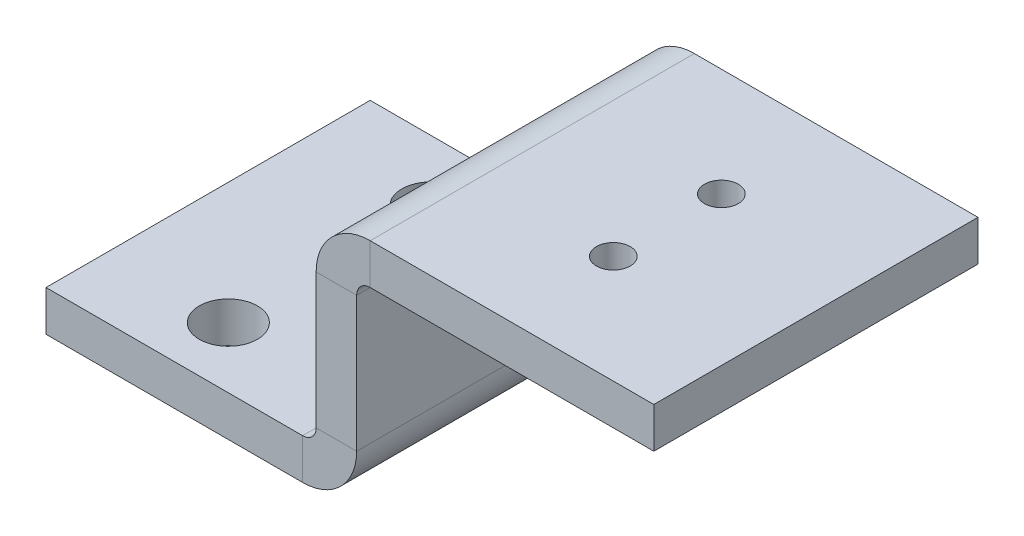
ISO-10303-21;
HEADER;
FILE_DESCRIPTION(('STEP AP214'),'2;1');
FILE_NAME('part.step','',(''),(''),'','','');
FILE_SCHEMA(('AUTOMOTIVE_DESIGN { 1 0 10303 214 1 1 1 1 }'));
ENDSEC;
DATA;
#1=APPLICATION_CONTEXT('core data for automotive mechanical design processes');
#2=APPLICATION_PROTOCOL_DEFINITION('international standard','automotive_design',2000,#1);
#3=PRODUCT_CONTEXT('',#1,'mechanical');
#4=PRODUCT('Part','Part','',(#3));
#5=PRODUCT_RELATED_PRODUCT_CATEGORY('part','',(#4));
#6=PRODUCT_DEFINITION_FORMATION('','',#4);
#7=PRODUCT_DEFINITION_CONTEXT('part definition',#1,'design');
#8=PRODUCT_DEFINITION('design','',#6,#7);
#9=PRODUCT_DEFINITION_SHAPE('','',#8);
#10=(LENGTH_UNIT() NAMED_UNIT(*) SI_UNIT(.MILLI.,.METRE.));
#11=(NAMED_UNIT(*) PLANE_ANGLE_UNIT() SI_UNIT($,.RADIAN.));
#12=(NAMED_UNIT(*) SI_UNIT($,.STERADIAN.) SOLID_ANGLE_UNIT());
#13=UNCERTAINTY_MEASURE_WITH_UNIT(LENGTH_MEASURE(1.E-05),#10,'distance_accuracy_value','');
#14=(GEOMETRIC_REPRESENTATION_CONTEXT(3) GLOBAL_UNCERTAINTY_ASSIGNED_CONTEXT((#13)) GLOBAL_UNIT_ASSIGNED_CONTEXT((#10,
#11,#12)) REPRESENTATION_CONTEXT('',''));
#15=CARTESIAN_POINT('',(0.,0.,0.));
#16=DIRECTION('',(0.,0.,1.));
#17=DIRECTION('',(1.,0.,0.));
#18=AXIS2_PLACEMENT_3D('',#15,#16,#17);
#19=CARTESIAN_POINT('',(0.,1.,24.));
#20=DIRECTION('',(0.,0.,1.));
#21=DIRECTION('',(1.,0.,0.));
#22=AXIS2_PLACEMENT_3D('',#19,#20,#21);
#23=PLANE('',#22);
#24=DIRECTION('',(1.,0.,0.));
#25=VECTOR('',#24,1.);
#26=CARTESIAN_POINT('',(0.,1.,24.));
#27=LINE('',#26,#25);
#28=CARTESIAN_POINT('',(0.,1.,24.));
#29=VERTEX_POINT('',#28);
#30=CARTESIAN_POINT('',(3.,1.,24.));
#31=VERTEX_POINT('',#30);
#32=EDGE_CURVE('E11',#29,#31,#27,.T.);
#33=ORIENTED_EDGE('',*,*,#32,.F.);
#34=CARTESIAN_POINT('',(-1.,1.,24.));
#35=DIRECTION('',(0.,0.,-1.));
#36=DIRECTION('',(-1.,0.,0.));
#37=AXIS2_PLACEMENT_3D('',#34,#35,#36);
#38=CIRCLE('',#37,1.);
#39=CARTESIAN_POINT('',(-1.,0.,24.));
#40=VERTEX_POINT('',#39);
#41=EDGE_CURVE('E250',#40,#29,#38,.F.);
#42=ORIENTED_EDGE('',*,*,#41,.F.);
#43=DIRECTION('',(0.,1.,0.));
#44=VECTOR('',#43,1.);
#45=CARTESIAN_POINT('',(-1.,-3.,24.));
#46=LINE('',#45,#44);
#47=CARTESIAN_POINT('',(-1.,-3.,24.));
#48=VERTEX_POINT('',#47);
#49=EDGE_CURVE('E47',#48,#40,#46,.T.);
#50=ORIENTED_EDGE('',*,*,#49,.F.);
#51=CARTESIAN_POINT('',(-1.,1.,24.));
#52=DIRECTION('',(0.,0.,1.));
#53=DIRECTION('',(1.,0.,0.));
#54=AXIS2_PLACEMENT_3D('',#51,#52,#53);
#55=CIRCLE('',#54,4.);
#56=EDGE_CURVE('E148',#48,#31,#55,.T.);
#57=ORIENTED_EDGE('',*,*,#56,.T.);
#58=EDGE_LOOP('',(#33,#42,#50,#57));
#59=FACE_BOUND('',#58,.T.);
#60=ADVANCED_FACE('F39',(#59),#23,.T.);
#61=CARTESIAN_POINT('',(-1.,-3.,24.));
#62=DIRECTION('',(0.,0.,1.));
#63=DIRECTION('',(1.,0.,0.));
#64=AXIS2_PLACEMENT_3D('',#61,#62,#63);
#65=PLANE('',#64);
#66=DIRECTION('',(0.,1.,0.));
#67=VECTOR('',#66,1.);
#68=CARTESIAN_POINT('',(0.,0.,24.));
#69=LINE('',#68,#67);
#70=CARTESIAN_POINT('',(0.,11.,24.));
#71=VERTEX_POINT('',#70);
#72=EDGE_CURVE('E142',#29,#71,#69,.T.);
#73=ORIENTED_EDGE('',*,*,#72,.F.);
#74=ORIENTED_EDGE('',*,*,#32,.T.);
#75=DIRECTION('',(0.,1.,0.));
#76=VECTOR('',#75,1.);
#77=CARTESIAN_POINT('',(3.,0.,24.));
#78=LINE('',#77,#76);
#79=CARTESIAN_POINT('',(3.,11.,24.));
#80=VERTEX_POINT('',#79);
#81=EDGE_CURVE('E139',#31,#80,#78,.T.);
#82=ORIENTED_EDGE('',*,*,#81,.T.);
#83=DIRECTION('',(-1.,0.,0.));
#84=VECTOR('',#83,1.);
#85=CARTESIAN_POINT('',(3.,11.,24.));
#86=LINE('',#85,#84);
#87=EDGE_CURVE('E231',#80,#71,#86,.T.);
#88=ORIENTED_EDGE('',*,*,#87,.T.);
#89=EDGE_LOOP('',(#73,#74,#82,#88));
#90=FACE_BOUND('',#89,.T.);
#91=ADVANCED_FACE('F137',(#90),#65,.T.);
#92=CARTESIAN_POINT('',(-1.,0.,0.));
#93=DIRECTION('',(0.,0.,-1.));
#94=DIRECTION('',(-1.,0.,0.));
#95=AXIS2_PLACEMENT_3D('',#92,#93,#94);
#96=PLANE('',#95);
#97=DIRECTION('',(0.,-1.,0.));
#98=VECTOR('',#97,1.);
#99=CARTESIAN_POINT('',(-1.,0.,0.));
#100=LINE('',#99,#98);
#101=CARTESIAN_POINT('',(-1.,0.,0.));
#102=VERTEX_POINT('',#101);
#103=CARTESIAN_POINT('',(-1.,-3.,0.));
#104=VERTEX_POINT('',#103);
#105=EDGE_CURVE('E236',#102,#104,#100,.T.);
#106=ORIENTED_EDGE('',*,*,#105,.F.);
#107=CARTESIAN_POINT('',(-1.,1.,0.));
#108=DIRECTION('',(0.,0.,-1.));
#109=DIRECTION('',(-1.,0.,0.));
#110=AXIS2_PLACEMENT_3D('',#107,#108,#109);
#111=CIRCLE('',#110,1.);
#112=CARTESIAN_POINT('',(0.,1.,0.));
#113=VERTEX_POINT('',#112);
#114=EDGE_CURVE('E188',#102,#113,#111,.F.);
#115=ORIENTED_EDGE('',*,*,#114,.T.);
#116=DIRECTION('',(-1.,0.,0.));
#117=VECTOR('',#116,1.);
#118=CARTESIAN_POINT('',(3.,1.,0.));
#119=LINE('',#118,#117);
#120=CARTESIAN_POINT('',(3.,1.,0.));
#121=VERTEX_POINT('',#120);
#122=EDGE_CURVE('E234',#121,#113,#119,.T.);
#123=ORIENTED_EDGE('',*,*,#122,.F.);
#124=CARTESIAN_POINT('',(-1.,1.,0.));
#125=DIRECTION('',(0.,0.,1.));
#126=DIRECTION('',(1.,0.,0.));
#127=AXIS2_PLACEMENT_3D('',#124,#125,#126);
#128=CIRCLE('',#127,4.);
#129=EDGE_CURVE('E160',#104,#121,#128,.T.);
#130=ORIENTED_EDGE('',*,*,#129,.F.);
#131=EDGE_LOOP('',(#106,#115,#123,#130));
#132=FACE_BOUND('',#131,.T.);
#133=ADVANCED_FACE('F319',(#132),#96,.T.);
#134=CARTESIAN_POINT('',(3.,1.,0.));
#135=DIRECTION('',(0.,0.,-1.));
#136=DIRECTION('',(-1.,0.,0.));
#137=AXIS2_PLACEMENT_3D('',#134,#135,#136);
#138=PLANE('',#137);
#139=DIRECTION('',(1.,0.,0.));
#140=VECTOR('',#139,1.);
#141=CARTESIAN_POINT('',(0.,0.,0.));
#142=LINE('',#141,#140);
#143=CARTESIAN_POINT('',(-20.,0.,0.));
#144=VERTEX_POINT('',#143);
#145=EDGE_CURVE('E191',#144,#102,#142,.T.);
#146=ORIENTED_EDGE('',*,*,#145,.T.);
#147=ORIENTED_EDGE('',*,*,#105,.T.);
#148=DIRECTION('',(1.,0.,0.));
#149=VECTOR('',#148,1.);
#150=CARTESIAN_POINT('',(0.,-3.,0.));
#151=LINE('',#150,#149);
#152=CARTESIAN_POINT('',(-20.,-3.,0.));
#153=VERTEX_POINT('',#152);
#154=EDGE_CURVE('E197',#153,#104,#151,.T.);
#155=ORIENTED_EDGE('',*,*,#154,.F.);
#156=DIRECTION('',(0.,1.,0.));
#157=VECTOR('',#156,1.);
#158=CARTESIAN_POINT('',(-20.,-3.,0.));
#159=LINE('',#158,#157);
#160=EDGE_CURVE('E194',#153,#144,#159,.T.);
#161=ORIENTED_EDGE('',*,*,#160,.T.);
#162=EDGE_LOOP('',(#146,#147,#155,#161));
#163=FACE_BOUND('',#162,.T.);
#164=ADVANCED_FACE('F322',(#163),#138,.T.);
#165=CARTESIAN_POINT('',(4.,15.,24.));
#166=DIRECTION('',(0.,0.,1.));
#167=DIRECTION('',(1.,0.,0.));
#168=AXIS2_PLACEMENT_3D('',#165,#166,#167);
#169=PLANE('',#168);
#170=DIRECTION('',(0.,-1.,0.));
#171=VECTOR('',#170,1.);
#172=CARTESIAN_POINT('',(4.,15.,24.));
#173=LINE('',#172,#171);
#174=CARTESIAN_POINT('',(4.,15.,24.));
#175=VERTEX_POINT('',#174);
#176=CARTESIAN_POINT('',(4.,12.,24.));
#177=VERTEX_POINT('',#176);
#178=EDGE_CURVE('E55',#175,#177,#173,.T.);
#179=ORIENTED_EDGE('',*,*,#178,.F.);
#180=CARTESIAN_POINT('',(4.,11.,24.));
#181=DIRECTION('',(0.,0.,1.));
#182=DIRECTION('',(1.,0.,0.));
#183=AXIS2_PLACEMENT_3D('',#180,#181,#182);
#184=CIRCLE('',#183,4.);
#185=EDGE_CURVE('E260',#71,#175,#184,.F.);
#186=ORIENTED_EDGE('',*,*,#185,.F.);
#187=ORIENTED_EDGE('',*,*,#87,.F.);
#188=CARTESIAN_POINT('',(4.,11.,24.));
#189=DIRECTION('',(0.,0.,1.));
#190=DIRECTION('',(1.,0.,0.));
#191=AXIS2_PLACEMENT_3D('',#188,#189,#190);
#192=CIRCLE('',#191,1.);
#193=EDGE_CURVE('E168',#80,#177,#192,.F.);
#194=ORIENTED_EDGE('',*,*,#193,.T.);
#195=EDGE_LOOP('',(#179,#186,#187,#194));
#196=FACE_BOUND('',#195,.T.);
#197=ADVANCED_FACE('F349',(#196),#169,.T.);
#198=CARTESIAN_POINT('',(3.,11.,24.));
#199=DIRECTION('',(0.,0.,1.));
#200=DIRECTION('',(1.,0.,0.));
#201=AXIS2_PLACEMENT_3D('',#198,#199,#200);
#202=PLANE('',#201);
#203=DIRECTION('',(1.,0.,0.));
#204=VECTOR('',#203,1.);
#205=CARTESIAN_POINT('',(0.,15.,24.));
#206=LINE('',#205,#204);
#207=CARTESIAN_POINT('',(25.,15.,24.));
#208=VERTEX_POINT('',#207);
#209=EDGE_CURVE('E263',#175,#208,#206,.T.);
#210=ORIENTED_EDGE('',*,*,#209,.F.);
#211=ORIENTED_EDGE('',*,*,#178,.T.);
#212=DIRECTION('',(1.,0.,0.));
#213=VECTOR('',#212,1.);
#214=CARTESIAN_POINT('',(0.,12.,24.));
#215=LINE('',#214,#213);
#216=CARTESIAN_POINT('',(25.,12.,24.));
#217=VERTEX_POINT('',#216);
#218=EDGE_CURVE('E109',#177,#217,#215,.T.);
#219=ORIENTED_EDGE('',*,*,#218,.T.);
#220=DIRECTION('',(0.,-1.,0.));
#221=VECTOR('',#220,1.);
#222=CARTESIAN_POINT('',(25.,15.,24.));
#223=LINE('',#222,#221);
#224=EDGE_CURVE('E266',#208,#217,#223,.T.);
#225=ORIENTED_EDGE('',*,*,#224,.F.);
#226=EDGE_LOOP('',(#210,#211,#219,#225));
#227=FACE_BOUND('',#226,.T.);
#228=ADVANCED_FACE('F352',(#227),#202,.T.);
#229=CARTESIAN_POINT('',(0.,11.,0.));
#230=DIRECTION('',(0.,0.,-1.));
#231=DIRECTION('',(-1.,0.,0.));
#232=AXIS2_PLACEMENT_3D('',#229,#230,#231);
#233=PLANE('',#232);
#234=DIRECTION('',(1.,0.,0.));
#235=VECTOR('',#234,1.);
#236=CARTESIAN_POINT('',(0.,11.,0.));
#237=LINE('',#236,#235);
#238=CARTESIAN_POINT('',(0.,11.,0.));
#239=VERTEX_POINT('',#238);
#240=CARTESIAN_POINT('',(3.,11.,0.));
#241=VERTEX_POINT('',#240);
#242=EDGE_CURVE('E96',#239,#241,#237,.T.);
#243=ORIENTED_EDGE('',*,*,#242,.F.);
#244=CARTESIAN_POINT('',(4.,11.,0.));
#245=DIRECTION('',(0.,0.,1.));
#246=DIRECTION('',(1.,0.,0.));
#247=AXIS2_PLACEMENT_3D('',#244,#245,#246);
#248=CIRCLE('',#247,4.);
#249=CARTESIAN_POINT('',(4.,15.,0.));
#250=VERTEX_POINT('',#249);
#251=EDGE_CURVE('E184',#239,#250,#248,.F.);
#252=ORIENTED_EDGE('',*,*,#251,.T.);
#253=DIRECTION('',(0.,1.,0.));
#254=VECTOR('',#253,1.);
#255=CARTESIAN_POINT('',(4.,12.,0.));
#256=LINE('',#255,#254);
#257=CARTESIAN_POINT('',(4.,12.,0.));
#258=VERTEX_POINT('',#257);
#259=EDGE_CURVE('E103',#258,#250,#256,.T.);
#260=ORIENTED_EDGE('',*,*,#259,.F.);
#261=CARTESIAN_POINT('',(4.,11.,0.));
#262=DIRECTION('',(0.,0.,1.));
#263=DIRECTION('',(1.,0.,0.));
#264=AXIS2_PLACEMENT_3D('',#261,#262,#263);
#265=CIRCLE('',#264,1.);
#266=EDGE_CURVE('E203',#241,#258,#265,.F.);
#267=ORIENTED_EDGE('',*,*,#266,.F.);
#268=EDGE_LOOP('',(#243,#252,#260,#267));
#269=FACE_BOUND('',#268,.T.);
#270=ADVANCED_FACE('F310',(#269),#233,.T.);
#271=CARTESIAN_POINT('',(4.,12.,0.));
#272=DIRECTION('',(0.,0.,-1.));
#273=DIRECTION('',(-1.,0.,0.));
#274=AXIS2_PLACEMENT_3D('',#271,#272,#273);
#275=PLANE('',#274);
#276=DIRECTION('',(0.,1.,0.));
#277=VECTOR('',#276,1.);
#278=CARTESIAN_POINT('',(0.,0.,0.));
#279=LINE('',#278,#277);
#280=EDGE_CURVE('E186',#113,#239,#279,.T.);
#281=ORIENTED_EDGE('',*,*,#280,.T.);
#282=ORIENTED_EDGE('',*,*,#242,.T.);
#283=DIRECTION('',(0.,1.,0.));
#284=VECTOR('',#283,1.);
#285=CARTESIAN_POINT('',(3.,0.,0.));
#286=LINE('',#285,#284);
#287=EDGE_CURVE('E201',#121,#241,#286,.T.);
#288=ORIENTED_EDGE('',*,*,#287,.F.);
#289=ORIENTED_EDGE('',*,*,#122,.T.);
#290=EDGE_LOOP('',(#281,#282,#288,#289));
#291=FACE_BOUND('',#290,.T.);
#292=ADVANCED_FACE('F315',(#291),#275,.T.);
#293=CARTESIAN_POINT('',(0.,12.,24.));
#294=DIRECTION('',(0.,1.,0.));
#295=DIRECTION('',(0.,0.,1.));
#296=AXIS2_PLACEMENT_3D('',#293,#294,#295);
#297=PLANE('',#296);
#298=CARTESIAN_POINT('',(14.,12.,16.));
#299=DIRECTION('',(0.,1.,0.));
#300=DIRECTION('',(0.,0.,1.));
#301=AXIS2_PLACEMENT_3D('',#298,#299,#300);
#302=CIRCLE('',#301,1.24999999999999);
#303=CARTESIAN_POINT('',(14.,12.,17.25));
#304=VERTEX_POINT('',#303);
#305=EDGE_CURVE('E287',#304,#304,#302,.T.);
#306=ORIENTED_EDGE('',*,*,#305,.T.);
#307=EDGE_LOOP('',(#306));
#308=FACE_BOUND('',#307,.T.);
#309=CARTESIAN_POINT('',(14.,12.,8.));
#310=DIRECTION('',(0.,1.,0.));
#311=DIRECTION('',(0.,0.,1.));
#312=AXIS2_PLACEMENT_3D('',#309,#310,#311);
#313=CIRCLE('',#312,1.24999999999999);
#314=CARTESIAN_POINT('',(14.,12.,9.24999999999999));
#315=VERTEX_POINT('',#314);
#316=EDGE_CURVE('E281',#315,#315,#313,.T.);
#317=ORIENTED_EDGE('',*,*,#316,.T.);
#318=EDGE_LOOP('',(#317));
#319=FACE_BOUND('',#318,.T.);
#320=DIRECTION('',(1.,0.,0.));
#321=VECTOR('',#320,1.);
#322=CARTESIAN_POINT('',(0.,12.,0.));
#323=LINE('',#322,#321);
#324=CARTESIAN_POINT('',(25.,12.,0.));
#325=VERTEX_POINT('',#324);
#326=EDGE_CURVE('E174',#258,#325,#323,.T.);
#327=ORIENTED_EDGE('',*,*,#326,.T.);
#328=DIRECTION('',(0.,0.,-1.));
#329=VECTOR('',#328,1.);
#330=CARTESIAN_POINT('',(25.,12.,24.));
#331=LINE('',#330,#329);
#332=EDGE_CURVE('E227',#217,#325,#331,.T.);
#333=ORIENTED_EDGE('',*,*,#332,.F.);
#334=ORIENTED_EDGE('',*,*,#218,.F.);
#335=DIRECTION('',(0.,0.,-1.));
#336=VECTOR('',#335,1.);
#337=CARTESIAN_POINT('',(4.,12.,24.));
#338=LINE('',#337,#336);
#339=EDGE_CURVE('E170',#177,#258,#338,.T.);
#340=ORIENTED_EDGE('',*,*,#339,.T.);
#341=EDGE_LOOP('',(#327,#333,#334,#340));
#342=FACE_BOUND('',#341,.T.);
#343=ADVANCED_FACE('F360',(#308,#319,#342),#297,.F.);
#344=CARTESIAN_POINT('',(25.,15.,24.));
#345=DIRECTION('',(1.,0.,0.));
#346=DIRECTION('',(0.,0.,-1.));
#347=AXIS2_PLACEMENT_3D('',#344,#345,#346);
#348=PLANE('',#347);
#349=DIRECTION('',(0.,-1.,0.));
#350=VECTOR('',#349,1.);
#351=CARTESIAN_POINT('',(25.,15.,0.));
#352=LINE('',#351,#350);
#353=CARTESIAN_POINT('',(25.,15.,0.));
#354=VERTEX_POINT('',#353);
#355=EDGE_CURVE('E177',#354,#325,#352,.T.);
#356=ORIENTED_EDGE('',*,*,#355,.F.);
#357=DIRECTION('',(0.,0.,-1.));
#358=VECTOR('',#357,1.);
#359=CARTESIAN_POINT('',(25.,15.,24.));
#360=LINE('',#359,#358);
#361=EDGE_CURVE('E225',#208,#354,#360,.T.);
#362=ORIENTED_EDGE('',*,*,#361,.F.);
#363=ORIENTED_EDGE('',*,*,#224,.T.);
#364=ORIENTED_EDGE('',*,*,#332,.T.);
#365=EDGE_LOOP('',(#356,#362,#363,#364));
#366=FACE_BOUND('',#365,.T.);
#367=ADVANCED_FACE('F301',(#366),#348,.T.);
#368=CARTESIAN_POINT('',(0.,15.,24.));
#369=DIRECTION('',(0.,1.,0.));
#370=DIRECTION('',(0.,0.,1.));
#371=AXIS2_PLACEMENT_3D('',#368,#369,#370);
#372=PLANE('',#371);
#373=CARTESIAN_POINT('',(14.,15.,16.));
#374=DIRECTION('',(0.,1.,0.));
#375=DIRECTION('',(0.,0.,1.));
#376=AXIS2_PLACEMENT_3D('',#373,#374,#375);
#377=CIRCLE('',#376,1.24999999999999);
#378=CARTESIAN_POINT('',(14.,15.,17.25));
#379=VERTEX_POINT('',#378);
#380=EDGE_CURVE('E290',#379,#379,#377,.T.);
#381=ORIENTED_EDGE('',*,*,#380,.F.);
#382=EDGE_LOOP('',(#381));
#383=FACE_BOUND('',#382,.T.);
#384=CARTESIAN_POINT('',(14.,15.,8.));
#385=DIRECTION('',(0.,1.,0.));
#386=DIRECTION('',(0.,0.,1.));
#387=AXIS2_PLACEMENT_3D('',#384,#385,#386);
#388=CIRCLE('',#387,1.24999999999999);
#389=CARTESIAN_POINT('',(14.,15.,9.24999999999999));
#390=VERTEX_POINT('',#389);
#391=EDGE_CURVE('E284',#390,#390,#388,.T.);
#392=ORIENTED_EDGE('',*,*,#391,.F.);
#393=EDGE_LOOP('',(#392));
#394=FACE_BOUND('',#393,.T.);
#395=DIRECTION('',(1.,0.,0.));
#396=VECTOR('',#395,1.);
#397=CARTESIAN_POINT('',(0.,15.,0.));
#398=LINE('',#397,#396);
#399=EDGE_CURVE('E181',#250,#354,#398,.T.);
#400=ORIENTED_EDGE('',*,*,#399,.F.);
#401=DIRECTION('',(0.,0.,-1.));
#402=VECTOR('',#401,1.);
#403=CARTESIAN_POINT('',(4.,15.,24.));
#404=LINE('',#403,#402);
#405=EDGE_CURVE('E222',#175,#250,#404,.T.);
#406=ORIENTED_EDGE('',*,*,#405,.F.);
#407=ORIENTED_EDGE('',*,*,#209,.T.);
#408=ORIENTED_EDGE('',*,*,#361,.T.);
#409=EDGE_LOOP('',(#400,#406,#407,#408));
#410=FACE_BOUND('',#409,.T.);
#411=ADVANCED_FACE('F297',(#383,#394,#410),#372,.T.);
#412=CARTESIAN_POINT('',(4.,11.,24.));
#413=DIRECTION('',(0.,0.,-1.));
#414=DIRECTION('',(-1.,0.,0.));
#415=AXIS2_PLACEMENT_3D('',#412,#413,#414);
#416=CYLINDRICAL_SURFACE('',#415,4.);
#417=ORIENTED_EDGE('',*,*,#251,.F.);
#418=DIRECTION('',(0.,0.,-1.));
#419=VECTOR('',#418,1.);
#420=CARTESIAN_POINT('',(0.,11.,24.));
#421=LINE('',#420,#419);
#422=EDGE_CURVE('E219',#71,#239,#421,.T.);
#423=ORIENTED_EDGE('',*,*,#422,.F.);
#424=ORIENTED_EDGE('',*,*,#185,.T.);
#425=ORIENTED_EDGE('',*,*,#405,.T.);
#426=EDGE_LOOP('',(#417,#423,#424,#425));
#427=FACE_BOUND('',#426,.T.);
#428=ADVANCED_FACE('F300',(#427),#416,.T.);
#429=CARTESIAN_POINT('',(0.,0.,24.));
#430=DIRECTION('',(-1.,0.,0.));
#431=DIRECTION('',(0.,0.,1.));
#432=AXIS2_PLACEMENT_3D('',#429,#430,#431);
#433=PLANE('',#432);
#434=ORIENTED_EDGE('',*,*,#280,.F.);
#435=DIRECTION('',(0.,0.,-1.));
#436=VECTOR('',#435,1.);
#437=CARTESIAN_POINT('',(0.,1.,24.));
#438=LINE('',#437,#436);
#439=EDGE_CURVE('E216',#29,#113,#438,.T.);
#440=ORIENTED_EDGE('',*,*,#439,.F.);
#441=ORIENTED_EDGE('',*,*,#72,.T.);
#442=ORIENTED_EDGE('',*,*,#422,.T.);
#443=EDGE_LOOP('',(#434,#440,#441,#442));
#444=FACE_BOUND('',#443,.T.);
#445=ADVANCED_FACE('F317',(#444),#433,.T.);
#446=CARTESIAN_POINT('',(-1.,1.,24.));
#447=DIRECTION('',(0.,0.,-1.));
#448=DIRECTION('',(-1.,0.,0.));
#449=AXIS2_PLACEMENT_3D('',#446,#447,#448);
#450=CYLINDRICAL_SURFACE('',#449,1.);
#451=ORIENTED_EDGE('',*,*,#114,.F.);
#452=DIRECTION('',(0.,0.,-1.));
#453=VECTOR('',#452,1.);
#454=CARTESIAN_POINT('',(-1.,0.,24.));
#455=LINE('',#454,#453);
#456=EDGE_CURVE('E213',#40,#102,#455,.T.);
#457=ORIENTED_EDGE('',*,*,#456,.F.);
#458=ORIENTED_EDGE('',*,*,#41,.T.);
#459=ORIENTED_EDGE('',*,*,#439,.T.);
#460=EDGE_LOOP('',(#451,#457,#458,#459));
#461=FACE_BOUND('',#460,.T.);
#462=ADVANCED_FACE('F249',(#461),#450,.F.);
#463=CARTESIAN_POINT('',(0.,0.,24.));
#464=DIRECTION('',(0.,1.,0.));
#465=DIRECTION('',(-1.,0.,0.));
#466=AXIS2_PLACEMENT_3D('',#463,#464,#465);
#467=PLANE('',#466);
#468=CARTESIAN_POINT('',(-11.,0.,19.5));
#469=DIRECTION('',(0.,1.,0.));
#470=DIRECTION('',(0.,0.,1.));
#471=AXIS2_PLACEMENT_3D('',#468,#469,#470);
#472=CIRCLE('',#471,2.15);
#473=CARTESIAN_POINT('',(-11.,0.,21.65));
#474=VERTEX_POINT('',#473);
#475=EDGE_CURVE('E278',#474,#474,#472,.T.);
#476=ORIENTED_EDGE('',*,*,#475,.F.);
#477=EDGE_LOOP('',(#476));
#478=FACE_BOUND('',#477,.T.);
#479=CARTESIAN_POINT('',(-11.,0.,4.5));
#480=DIRECTION('',(0.,1.,0.));
#481=DIRECTION('',(0.,0.,1.));
#482=AXIS2_PLACEMENT_3D('',#479,#480,#481);
#483=CIRCLE('',#482,2.15);
#484=CARTESIAN_POINT('',(-11.,0.,6.65));
#485=VERTEX_POINT('',#484);
#486=EDGE_CURVE('E272',#485,#485,#483,.T.);
#487=ORIENTED_EDGE('',*,*,#486,.F.);
#488=EDGE_LOOP('',(#487));
#489=FACE_BOUND('',#488,.T.);
#490=ORIENTED_EDGE('',*,*,#145,.F.);
#491=DIRECTION('',(0.,0.,-1.));
#492=VECTOR('',#491,1.);
#493=CARTESIAN_POINT('',(-20.,0.,24.));
#494=LINE('',#493,#492);
#495=CARTESIAN_POINT('',(-20.,0.,24.));
#496=VERTEX_POINT('',#495);
#497=EDGE_CURVE('E211',#496,#144,#494,.T.);
#498=ORIENTED_EDGE('',*,*,#497,.F.);
#499=DIRECTION('',(1.,0.,0.));
#500=VECTOR('',#499,1.);
#501=CARTESIAN_POINT('',(0.,0.,24.));
#502=LINE('',#501,#500);
#503=EDGE_CURVE('E243',#496,#40,#502,.T.);
#504=ORIENTED_EDGE('',*,*,#503,.T.);
#505=ORIENTED_EDGE('',*,*,#456,.T.);
#506=EDGE_LOOP('',(#490,#498,#504,#505));
#507=FACE_BOUND('',#506,.T.);
#508=ADVANCED_FACE('F254',(#478,#489,#507),#467,.T.);
#509=CARTESIAN_POINT('',(-20.,-3.,24.));
#510=DIRECTION('',(-1.,0.,0.));
#511=DIRECTION('',(0.,0.,1.));
#512=AXIS2_PLACEMENT_3D('',#509,#510,#511);
#513=PLANE('',#512);
#514=ORIENTED_EDGE('',*,*,#160,.F.);
#515=DIRECTION('',(0.,0.,-1.));
#516=VECTOR('',#515,1.);
#517=CARTESIAN_POINT('',(-20.,-3.,24.));
#518=LINE('',#517,#516);
#519=CARTESIAN_POINT('',(-20.,-3.,24.));
#520=VERTEX_POINT('',#519);
#521=EDGE_CURVE('E209',#520,#153,#518,.T.);
#522=ORIENTED_EDGE('',*,*,#521,.F.);
#523=DIRECTION('',(0.,1.,0.));
#524=VECTOR('',#523,1.);
#525=CARTESIAN_POINT('',(-20.,-3.,24.));
#526=LINE('',#525,#524);
#527=EDGE_CURVE('E255',#520,#496,#526,.T.);
#528=ORIENTED_EDGE('',*,*,#527,.T.);
#529=ORIENTED_EDGE('',*,*,#497,.T.);
#530=EDGE_LOOP('',(#514,#522,#528,#529));
#531=FACE_BOUND('',#530,.T.);
#532=ADVANCED_FACE('F327',(#531),#513,.T.);
#533=CARTESIAN_POINT('',(0.,-3.,24.));
#534=DIRECTION('',(0.,1.,0.));
#535=DIRECTION('',(-1.,0.,0.));
#536=AXIS2_PLACEMENT_3D('',#533,#534,#535);
#537=PLANE('',#536);
#538=CARTESIAN_POINT('',(-11.,-3.00000000000001,19.5));
#539=DIRECTION('',(0.,1.,0.));
#540=DIRECTION('',(0.,0.,1.));
#541=AXIS2_PLACEMENT_3D('',#538,#539,#540);
#542=CIRCLE('',#541,2.15);
#543=CARTESIAN_POINT('',(-11.,-3.00000000000001,21.65));
#544=VERTEX_POINT('',#543);
#545=EDGE_CURVE('E275',#544,#544,#542,.T.);
#546=ORIENTED_EDGE('',*,*,#545,.T.);
#547=EDGE_LOOP('',(#546));
#548=FACE_BOUND('',#547,.T.);
#549=CARTESIAN_POINT('',(-11.,-3.00000000000001,4.5));
#550=DIRECTION('',(0.,1.,0.));
#551=DIRECTION('',(0.,0.,1.));
#552=AXIS2_PLACEMENT_3D('',#549,#550,#551);
#553=CIRCLE('',#552,2.15);
#554=CARTESIAN_POINT('',(-11.,-3.00000000000001,6.65));
#555=VERTEX_POINT('',#554);
#556=EDGE_CURVE('E178',#555,#555,#553,.T.);
#557=ORIENTED_EDGE('',*,*,#556,.T.);
#558=EDGE_LOOP('',(#557));
#559=FACE_BOUND('',#558,.T.);
#560=ORIENTED_EDGE('',*,*,#154,.T.);
#561=DIRECTION('',(0.,0.,-1.));
#562=VECTOR('',#561,1.);
#563=CARTESIAN_POINT('',(-1.,-3.,24.));
#564=LINE('',#563,#562);
#565=EDGE_CURVE('E162',#48,#104,#564,.T.);
#566=ORIENTED_EDGE('',*,*,#565,.F.);
#567=DIRECTION('',(1.,0.,0.));
#568=VECTOR('',#567,1.);
#569=CARTESIAN_POINT('',(0.,-3.,24.));
#570=LINE('',#569,#568);
#571=EDGE_CURVE('E153',#520,#48,#570,.T.);
#572=ORIENTED_EDGE('',*,*,#571,.F.);
#573=ORIENTED_EDGE('',*,*,#521,.T.);
#574=EDGE_LOOP('',(#560,#566,#572,#573));
#575=FACE_BOUND('',#574,.T.);
#576=ADVANCED_FACE('F325',(#548,#559,#575),#537,.F.);
#577=CARTESIAN_POINT('',(-1.,1.,24.));
#578=DIRECTION('',(0.,0.,-1.));
#579=DIRECTION('',(-1.,0.,0.));
#580=AXIS2_PLACEMENT_3D('',#577,#578,#579);
#581=CYLINDRICAL_SURFACE('',#580,4.);
#582=ORIENTED_EDGE('',*,*,#129,.T.);
#583=DIRECTION('',(0.,0.,-1.));
#584=VECTOR('',#583,1.);
#585=CARTESIAN_POINT('',(3.,1.,24.));
#586=LINE('',#585,#584);
#587=EDGE_CURVE('E157',#31,#121,#586,.T.);
#588=ORIENTED_EDGE('',*,*,#587,.F.);
#589=ORIENTED_EDGE('',*,*,#56,.F.);
#590=ORIENTED_EDGE('',*,*,#565,.T.);
#591=EDGE_LOOP('',(#582,#588,#589,#590));
#592=FACE_BOUND('',#591,.T.);
#593=ADVANCED_FACE('F158',(#592),#581,.T.);
#594=CARTESIAN_POINT('',(3.,0.,24.));
#595=DIRECTION('',(-1.,0.,0.));
#596=DIRECTION('',(0.,0.,1.));
#597=AXIS2_PLACEMENT_3D('',#594,#595,#596);
#598=PLANE('',#597);
#599=ORIENTED_EDGE('',*,*,#287,.T.);
#600=DIRECTION('',(0.,0.,-1.));
#601=VECTOR('',#600,1.);
#602=CARTESIAN_POINT('',(3.,11.,24.));
#603=LINE('',#602,#601);
#604=EDGE_CURVE('E163',#80,#241,#603,.T.);
#605=ORIENTED_EDGE('',*,*,#604,.F.);
#606=ORIENTED_EDGE('',*,*,#81,.F.);
#607=ORIENTED_EDGE('',*,*,#587,.T.);
#608=EDGE_LOOP('',(#599,#605,#606,#607));
#609=FACE_BOUND('',#608,.T.);
#610=ADVANCED_FACE('F165',(#609),#598,.F.);
#611=CARTESIAN_POINT('',(4.,11.,24.));
#612=DIRECTION('',(0.,0.,-1.));
#613=DIRECTION('',(-1.,0.,0.));
#614=AXIS2_PLACEMENT_3D('',#611,#612,#613);
#615=CYLINDRICAL_SURFACE('',#614,1.);
#616=ORIENTED_EDGE('',*,*,#266,.T.);
#617=ORIENTED_EDGE('',*,*,#339,.F.);
#618=ORIENTED_EDGE('',*,*,#193,.F.);
#619=ORIENTED_EDGE('',*,*,#604,.T.);
#620=EDGE_LOOP('',(#616,#617,#618,#619));
#621=FACE_BOUND('',#620,.T.);
#622=ADVANCED_FACE('F475',(#621),#615,.F.);
#623=CARTESIAN_POINT('',(4.,11.,24.));
#624=DIRECTION('',(0.,0.,1.));
#625=DIRECTION('',(1.,0.,0.));
#626=AXIS2_PLACEMENT_3D('',#623,#624,#625);
#627=PLANE('',#626);
#628=ORIENTED_EDGE('',*,*,#571,.T.);
#629=ORIENTED_EDGE('',*,*,#49,.T.);
#630=ORIENTED_EDGE('',*,*,#503,.F.);
#631=ORIENTED_EDGE('',*,*,#527,.F.);
#632=EDGE_LOOP('',(#628,#629,#630,#631));
#633=FACE_BOUND('',#632,.T.);
#634=ADVANCED_FACE('F240',(#633),#627,.T.);
#635=CARTESIAN_POINT('',(4.,11.,0.));
#636=DIRECTION('',(0.,0.,1.));
#637=DIRECTION('',(1.,0.,0.));
#638=AXIS2_PLACEMENT_3D('',#635,#636,#637);
#639=PLANE('',#638);
#640=ORIENTED_EDGE('',*,*,#326,.F.);
#641=ORIENTED_EDGE('',*,*,#259,.T.);
#642=ORIENTED_EDGE('',*,*,#399,.T.);
#643=ORIENTED_EDGE('',*,*,#355,.T.);
#644=EDGE_LOOP('',(#640,#641,#642,#643));
#645=FACE_BOUND('',#644,.T.);
#646=ADVANCED_FACE('F388',(#645),#639,.F.);
#647=CARTESIAN_POINT('',(-11.,0.,4.5));
#648=DIRECTION('',(0.,1.,0.));
#649=DIRECTION('',(0.,0.,1.));
#650=AXIS2_PLACEMENT_3D('',#647,#648,#649);
#651=CYLINDRICAL_SURFACE('',#650,2.15);
#652=ORIENTED_EDGE('',*,*,#556,.F.);
#653=EDGE_LOOP('',(#652));
#654=FACE_BOUND('',#653,.T.);
#655=ORIENTED_EDGE('',*,*,#486,.T.);
#656=EDGE_LOOP('',(#655));
#657=FACE_BOUND('',#656,.T.);
#658=ADVANCED_FACE('F402',(#654,#657),#651,.F.);
#659=CARTESIAN_POINT('',(-11.,0.,19.5));
#660=DIRECTION('',(0.,1.,0.));
#661=DIRECTION('',(0.,0.,1.));
#662=AXIS2_PLACEMENT_3D('',#659,#660,#661);
#663=CYLINDRICAL_SURFACE('',#662,2.15);
#664=ORIENTED_EDGE('',*,*,#545,.F.);
#665=EDGE_LOOP('',(#664));
#666=FACE_BOUND('',#665,.T.);
#667=ORIENTED_EDGE('',*,*,#475,.T.);
#668=EDGE_LOOP('',(#667));
#669=FACE_BOUND('',#668,.T.);
#670=ADVANCED_FACE('F407',(#666,#669),#663,.F.);
#671=CARTESIAN_POINT('',(14.,15.,8.));
#672=DIRECTION('',(0.,1.,0.));
#673=DIRECTION('',(0.,0.,1.));
#674=AXIS2_PLACEMENT_3D('',#671,#672,#673);
#675=CYLINDRICAL_SURFACE('',#674,1.24999999999999);
#676=ORIENTED_EDGE('',*,*,#391,.T.);
#677=EDGE_LOOP('',(#676));
#678=FACE_BOUND('',#677,.T.);
#679=ORIENTED_EDGE('',*,*,#316,.F.);
#680=EDGE_LOOP('',(#679));
#681=FACE_BOUND('',#680,.T.);
#682=ADVANCED_FACE('F417',(#678,#681),#675,.F.);
#683=CARTESIAN_POINT('',(14.,15.,16.));
#684=DIRECTION('',(0.,1.,0.));
#685=DIRECTION('',(0.,0.,1.));
#686=AXIS2_PLACEMENT_3D('',#683,#684,#685);
#687=CYLINDRICAL_SURFACE('',#686,1.24999999999999);
#688=ORIENTED_EDGE('',*,*,#380,.T.);
#689=EDGE_LOOP('',(#688));
#690=FACE_BOUND('',#689,.T.);
#691=ORIENTED_EDGE('',*,*,#305,.F.);
#692=EDGE_LOOP('',(#691));
#693=FACE_BOUND('',#692,.T.);
#694=ADVANCED_FACE('F294',(#690,#693),#687,.F.);
#695=CLOSED_SHELL('',(#60,#91,#133,#164,#197,#228,#270,#292,#343,#367,#411,#428,#445,#462,#508,
#532,#576,#593,#610,#622,#634,#646,#658,#670,#682,#694));
#696=MANIFOLD_SOLID_BREP('B2',#695);
#697=ADVANCED_BREP_SHAPE_REPRESENTATION('',(#18,#696),#14);
#698=SHAPE_DEFINITION_REPRESENTATION(#9,#697);
ENDSEC;
END-ISO-10303-21;
